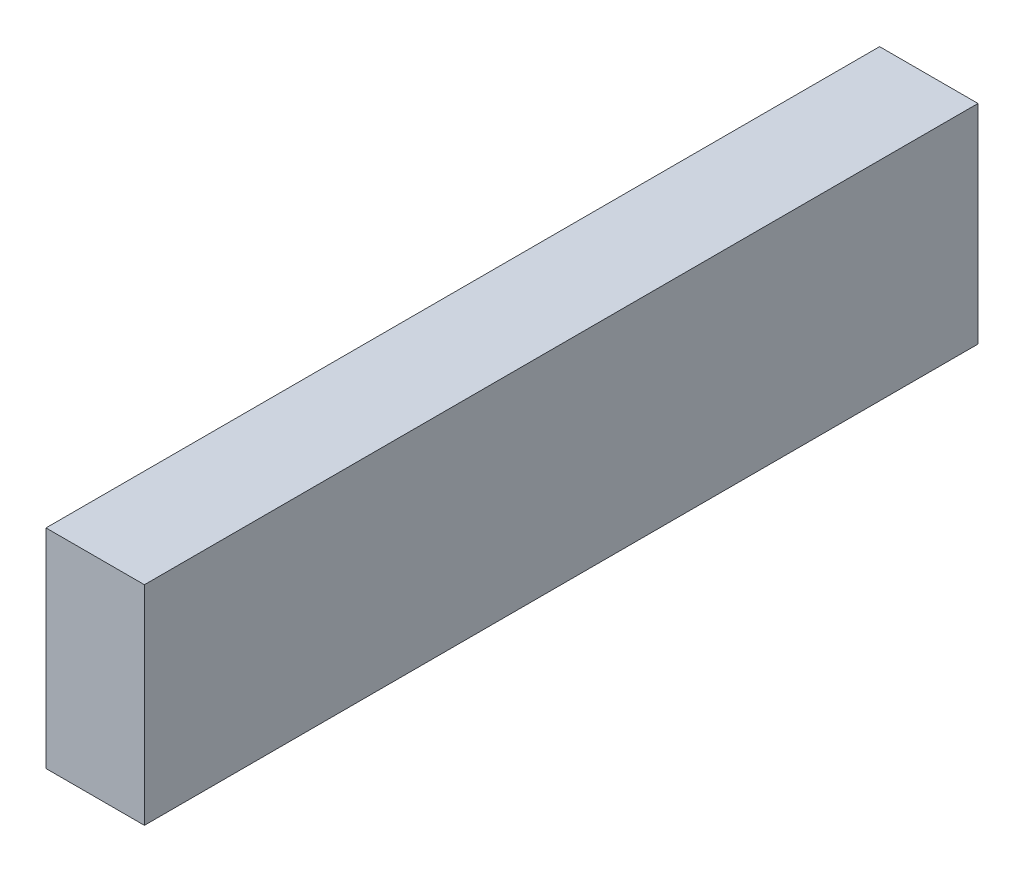
ISO-10303-21;
HEADER;
FILE_DESCRIPTION(('STEP AP214'),'2;1');
FILE_NAME('part.step','',(''),(''),'','','');
FILE_SCHEMA(('AUTOMOTIVE_DESIGN { 1 0 10303 214 1 1 1 1 }'));
ENDSEC;
DATA;
#1=APPLICATION_CONTEXT('core data for automotive mechanical design processes');
#2=APPLICATION_PROTOCOL_DEFINITION('international standard','automotive_design',2000,#1);
#3=PRODUCT_CONTEXT('',#1,'mechanical');
#4=PRODUCT('Part','Part','',(#3));
#5=PRODUCT_RELATED_PRODUCT_CATEGORY('part','',(#4));
#6=PRODUCT_DEFINITION_FORMATION('','',#4);
#7=PRODUCT_DEFINITION_CONTEXT('part definition',#1,'design');
#8=PRODUCT_DEFINITION('design','',#6,#7);
#9=PRODUCT_DEFINITION_SHAPE('','',#8);
#10=(LENGTH_UNIT() NAMED_UNIT(*) SI_UNIT(.MILLI.,.METRE.));
#11=(NAMED_UNIT(*) PLANE_ANGLE_UNIT() SI_UNIT($,.RADIAN.));
#12=(NAMED_UNIT(*) SI_UNIT($,.STERADIAN.) SOLID_ANGLE_UNIT());
#13=UNCERTAINTY_MEASURE_WITH_UNIT(LENGTH_MEASURE(1.E-05),#10,'distance_accuracy_value','');
#14=(GEOMETRIC_REPRESENTATION_CONTEXT(3) GLOBAL_UNCERTAINTY_ASSIGNED_CONTEXT((#13)) GLOBAL_UNIT_ASSIGNED_CONTEXT((#10,
#11,#12)) REPRESENTATION_CONTEXT('',''));
#15=CARTESIAN_POINT('',(0.,0.,0.));
#16=DIRECTION('',(0.,0.,1.));
#17=DIRECTION('',(1.,0.,0.));
#18=AXIS2_PLACEMENT_3D('',#15,#16,#17);
#19=CARTESIAN_POINT('',(8.99583333333333,-19.05,76.2));
#20=DIRECTION('',(-1.,0.,0.));
#21=DIRECTION('',(0.,0.,1.));
#22=AXIS2_PLACEMENT_3D('',#19,#20,#21);
#23=PLANE('',#22);
#24=DIRECTION('',(0.,1.,0.));
#25=VECTOR('',#24,1.);
#26=CARTESIAN_POINT('',(8.99583333333333,-19.05,-76.2));
#27=LINE('',#26,#25);
#28=CARTESIAN_POINT('',(8.99583333333333,-19.05,-76.2));
#29=VERTEX_POINT('',#28);
#30=CARTESIAN_POINT('',(8.99583333333333,19.05,-76.2));
#31=VERTEX_POINT('',#30);
#32=EDGE_CURVE('E97',#29,#31,#27,.T.);
#33=ORIENTED_EDGE('',*,*,#32,.T.);
#34=DIRECTION('',(0.,0.,-1.));
#35=VECTOR('',#34,1.);
#36=CARTESIAN_POINT('',(8.99583333333333,19.05,76.2));
#37=LINE('',#36,#35);
#38=CARTESIAN_POINT('',(8.99583333333333,19.05,76.2));
#39=VERTEX_POINT('',#38);
#40=EDGE_CURVE('E11',#39,#31,#37,.T.);
#41=ORIENTED_EDGE('',*,*,#40,.F.);
#42=DIRECTION('',(0.,1.,0.));
#43=VECTOR('',#42,1.);
#44=CARTESIAN_POINT('',(8.99583333333333,-19.05,76.2));
#45=LINE('',#44,#43);
#46=CARTESIAN_POINT('',(8.99583333333333,-19.05,76.2));
#47=VERTEX_POINT('',#46);
#48=EDGE_CURVE('E85',#47,#39,#45,.T.);
#49=ORIENTED_EDGE('',*,*,#48,.F.);
#50=DIRECTION('',(0.,0.,-1.));
#51=VECTOR('',#50,1.);
#52=CARTESIAN_POINT('',(8.99583333333333,-19.05,76.2));
#53=LINE('',#52,#51);
#54=EDGE_CURVE('E93',#47,#29,#53,.T.);
#55=ORIENTED_EDGE('',*,*,#54,.T.);
#56=EDGE_LOOP('',(#33,#41,#49,#55));
#57=FACE_BOUND('',#56,.T.);
#58=ADVANCED_FACE('F34',(#57),#23,.F.);
#59=CARTESIAN_POINT('',(-8.99583333333334,19.05,76.2));
#60=DIRECTION('',(0.,-1.,0.));
#61=DIRECTION('',(0.,0.,-1.));
#62=AXIS2_PLACEMENT_3D('',#59,#60,#61);
#63=PLANE('',#62);
#64=DIRECTION('',(-1.,0.,0.));
#65=VECTOR('',#64,1.);
#66=CARTESIAN_POINT('',(-8.99583333333334,19.05,-76.2));
#67=LINE('',#66,#65);
#68=CARTESIAN_POINT('',(-8.99583333333334,19.05,-76.2));
#69=VERTEX_POINT('',#68);
#70=EDGE_CURVE('E89',#31,#69,#67,.T.);
#71=ORIENTED_EDGE('',*,*,#70,.T.);
#72=DIRECTION('',(0.,0.,-1.));
#73=VECTOR('',#72,1.);
#74=CARTESIAN_POINT('',(-8.99583333333334,19.05,76.2));
#75=LINE('',#74,#73);
#76=CARTESIAN_POINT('',(-8.99583333333334,19.05,76.2));
#77=VERTEX_POINT('',#76);
#78=EDGE_CURVE('E42',#77,#69,#75,.T.);
#79=ORIENTED_EDGE('',*,*,#78,.F.);
#80=DIRECTION('',(-1.,0.,0.));
#81=VECTOR('',#80,1.);
#82=CARTESIAN_POINT('',(-8.99583333333334,19.05,76.2));
#83=LINE('',#82,#81);
#84=EDGE_CURVE('E80',#39,#77,#83,.T.);
#85=ORIENTED_EDGE('',*,*,#84,.F.);
#86=ORIENTED_EDGE('',*,*,#40,.T.);
#87=EDGE_LOOP('',(#71,#79,#85,#86));
#88=FACE_BOUND('',#87,.T.);
#89=ADVANCED_FACE('F88',(#88),#63,.F.);
#90=CARTESIAN_POINT('',(-8.99583333333334,-19.05,76.2));
#91=DIRECTION('',(1.,0.,0.));
#92=DIRECTION('',(0.,0.,-1.));
#93=AXIS2_PLACEMENT_3D('',#90,#91,#92);
#94=PLANE('',#93);
#95=DIRECTION('',(0.,-1.,0.));
#96=VECTOR('',#95,1.);
#97=CARTESIAN_POINT('',(-8.99583333333334,-19.05,-76.2));
#98=LINE('',#97,#96);
#99=CARTESIAN_POINT('',(-8.99583333333334,-19.05,-76.2));
#100=VERTEX_POINT('',#99);
#101=EDGE_CURVE('E67',#69,#100,#98,.T.);
#102=ORIENTED_EDGE('',*,*,#101,.T.);
#103=DIRECTION('',(0.,0.,-1.));
#104=VECTOR('',#103,1.);
#105=CARTESIAN_POINT('',(-8.99583333333334,-19.05,76.2));
#106=LINE('',#105,#104);
#107=CARTESIAN_POINT('',(-8.99583333333334,-19.05,76.2));
#108=VERTEX_POINT('',#107);
#109=EDGE_CURVE('E90',#108,#100,#106,.T.);
#110=ORIENTED_EDGE('',*,*,#109,.F.);
#111=DIRECTION('',(0.,-1.,0.));
#112=VECTOR('',#111,1.);
#113=CARTESIAN_POINT('',(-8.99583333333334,-19.05,76.2));
#114=LINE('',#113,#112);
#115=EDGE_CURVE('E83',#77,#108,#114,.T.);
#116=ORIENTED_EDGE('',*,*,#115,.F.);
#117=ORIENTED_EDGE('',*,*,#78,.T.);
#118=EDGE_LOOP('',(#102,#110,#116,#117));
#119=FACE_BOUND('',#118,.T.);
#120=ADVANCED_FACE('F91',(#119),#94,.F.);
#121=CARTESIAN_POINT('',(-8.99583333333334,-19.05,76.2));
#122=DIRECTION('',(0.,1.,0.));
#123=DIRECTION('',(0.,0.,1.));
#124=AXIS2_PLACEMENT_3D('',#121,#122,#123);
#125=PLANE('',#124);
#126=DIRECTION('',(1.,0.,0.));
#127=VECTOR('',#126,1.);
#128=CARTESIAN_POINT('',(-8.99583333333334,-19.05,-76.2));
#129=LINE('',#128,#127);
#130=EDGE_CURVE('E73',#100,#29,#129,.T.);
#131=ORIENTED_EDGE('',*,*,#130,.T.);
#132=ORIENTED_EDGE('',*,*,#54,.F.);
#133=DIRECTION('',(1.,0.,0.));
#134=VECTOR('',#133,1.);
#135=CARTESIAN_POINT('',(-8.99583333333334,-19.05,76.2));
#136=LINE('',#135,#134);
#137=EDGE_CURVE('E50',#108,#47,#136,.T.);
#138=ORIENTED_EDGE('',*,*,#137,.F.);
#139=ORIENTED_EDGE('',*,*,#109,.T.);
#140=EDGE_LOOP('',(#131,#132,#138,#139));
#141=FACE_BOUND('',#140,.T.);
#142=ADVANCED_FACE('F104',(#141),#125,.F.);
#143=CARTESIAN_POINT('',(0.,0.,76.2));
#144=DIRECTION('',(0.,0.,-1.));
#145=DIRECTION('',(-1.,0.,0.));
#146=AXIS2_PLACEMENT_3D('',#143,#144,#145);
#147=PLANE('',#146);
#148=ORIENTED_EDGE('',*,*,#48,.T.);
#149=ORIENTED_EDGE('',*,*,#84,.T.);
#150=ORIENTED_EDGE('',*,*,#115,.T.);
#151=ORIENTED_EDGE('',*,*,#137,.T.);
#152=EDGE_LOOP('',(#148,#149,#150,#151));
#153=FACE_BOUND('',#152,.T.);
#154=ADVANCED_FACE('F81',(#153),#147,.F.);
#155=CARTESIAN_POINT('',(0.,0.,-76.2));
#156=DIRECTION('',(0.,0.,-1.));
#157=DIRECTION('',(-1.,0.,0.));
#158=AXIS2_PLACEMENT_3D('',#155,#156,#157);
#159=PLANE('',#158);
#160=ORIENTED_EDGE('',*,*,#32,.F.);
#161=ORIENTED_EDGE('',*,*,#130,.F.);
#162=ORIENTED_EDGE('',*,*,#101,.F.);
#163=ORIENTED_EDGE('',*,*,#70,.F.);
#164=EDGE_LOOP('',(#160,#161,#162,#163));
#165=FACE_BOUND('',#164,.T.);
#166=ADVANCED_FACE('F107',(#165),#159,.T.);
#167=CLOSED_SHELL('',(#58,#89,#120,#142,#154,#166));
#168=MANIFOLD_SOLID_BREP('B2',#167);
#169=ADVANCED_BREP_SHAPE_REPRESENTATION('',(#18,#168),#14);
#170=SHAPE_DEFINITION_REPRESENTATION(#9,#169);
ENDSEC;
END-ISO-10303-21;
